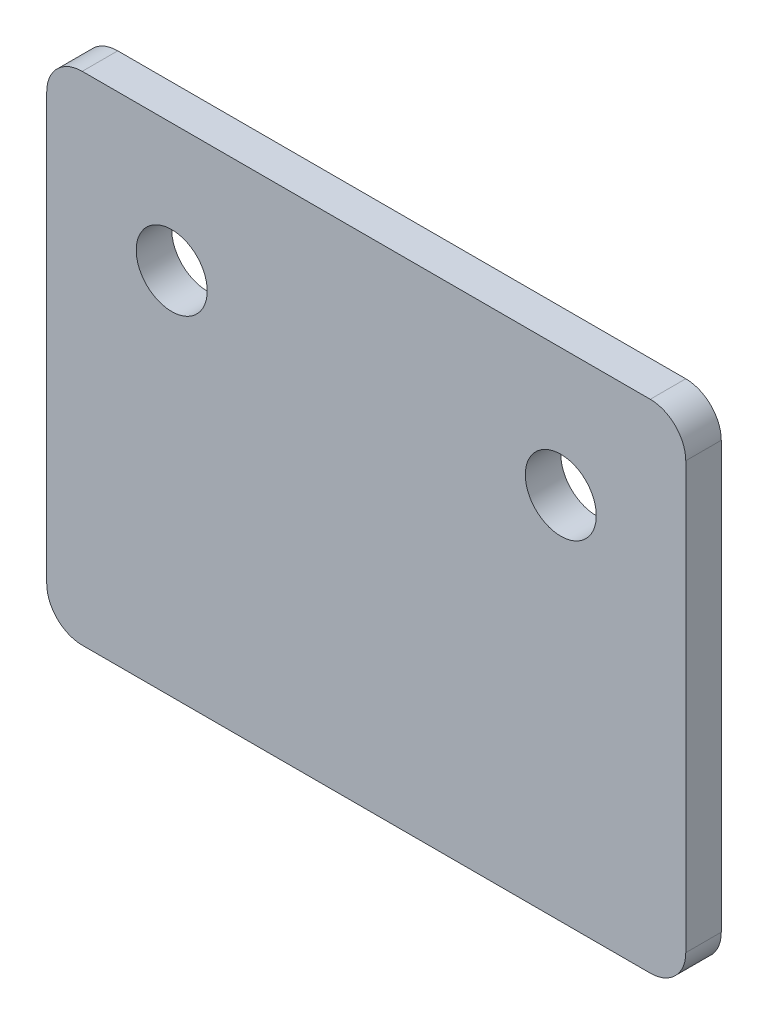
ISO-10303-21;
HEADER;
FILE_DESCRIPTION(('STEP AP214'),'2;1');
FILE_NAME('part.step','',(''),(''),'','','');
FILE_SCHEMA(('AUTOMOTIVE_DESIGN { 1 0 10303 214 1 1 1 1 }'));
ENDSEC;
DATA;
#1=APPLICATION_CONTEXT('core data for automotive mechanical design processes');
#2=APPLICATION_PROTOCOL_DEFINITION('international standard','automotive_design',2000,#1);
#3=PRODUCT_CONTEXT('',#1,'mechanical');
#4=PRODUCT('Part','Part','',(#3));
#5=PRODUCT_RELATED_PRODUCT_CATEGORY('part','',(#4));
#6=PRODUCT_DEFINITION_FORMATION('','',#4);
#7=PRODUCT_DEFINITION_CONTEXT('part definition',#1,'design');
#8=PRODUCT_DEFINITION('design','',#6,#7);
#9=PRODUCT_DEFINITION_SHAPE('','',#8);
#10=(LENGTH_UNIT() NAMED_UNIT(*) SI_UNIT(.MILLI.,.METRE.));
#11=(NAMED_UNIT(*) PLANE_ANGLE_UNIT() SI_UNIT($,.RADIAN.));
#12=(NAMED_UNIT(*) SI_UNIT($,.STERADIAN.) SOLID_ANGLE_UNIT());
#13=UNCERTAINTY_MEASURE_WITH_UNIT(LENGTH_MEASURE(1.E-05),#10,'distance_accuracy_value','');
#14=(GEOMETRIC_REPRESENTATION_CONTEXT(3) GLOBAL_UNCERTAINTY_ASSIGNED_CONTEXT((#13)) GLOBAL_UNIT_ASSIGNED_CONTEXT((#10,
#11,#12)) REPRESENTATION_CONTEXT('',''));
#15=CARTESIAN_POINT('',(0.,0.,0.));
#16=DIRECTION('',(0.,0.,1.));
#17=DIRECTION('',(1.,0.,0.));
#18=AXIS2_PLACEMENT_3D('',#15,#16,#17);
#19=CARTESIAN_POINT('',(-25.1539512231324,-35.029226262124,-3.175));
#20=DIRECTION('',(0.,0.,1.));
#21=DIRECTION('',(1.,0.,0.));
#22=AXIS2_PLACEMENT_3D('',#19,#20,#21);
#23=CYLINDRICAL_SURFACE('',#22,3.175);
#24=CARTESIAN_POINT('',(-25.1539512231324,-35.029226262124,0.));
#25=DIRECTION('',(0.,0.,1.));
#26=DIRECTION('',(1.,0.,0.));
#27=AXIS2_PLACEMENT_3D('',#24,#25,#26);
#28=CIRCLE('',#27,3.175);
#29=CARTESIAN_POINT('',(-28.3289512231324,-35.029226262124,0.));
#30=VERTEX_POINT('',#29);
#31=CARTESIAN_POINT('',(-25.1539512231323,-38.204226262124,0.));
#32=VERTEX_POINT('',#31);
#33=EDGE_CURVE('E133',#30,#32,#28,.T.);
#34=ORIENTED_EDGE('',*,*,#33,.F.);
#35=DIRECTION('',(0.,0.,1.));
#36=VECTOR('',#35,1.);
#37=CARTESIAN_POINT('',(-28.3289512231324,-35.029226262124,-3.175));
#38=LINE('',#37,#36);
#39=CARTESIAN_POINT('',(-28.3289512231324,-35.029226262124,-3.175));
#40=VERTEX_POINT('',#39);
#41=EDGE_CURVE('E11',#40,#30,#38,.T.);
#42=ORIENTED_EDGE('',*,*,#41,.F.);
#43=CARTESIAN_POINT('',(-25.1539512231324,-35.029226262124,-3.175));
#44=DIRECTION('',(0.,0.,1.));
#45=DIRECTION('',(1.,0.,0.));
#46=AXIS2_PLACEMENT_3D('',#43,#44,#45);
#47=CIRCLE('',#46,3.175);
#48=CARTESIAN_POINT('',(-25.1539512231323,-38.204226262124,-3.175));
#49=VERTEX_POINT('',#48);
#50=EDGE_CURVE('E154',#40,#49,#47,.T.);
#51=ORIENTED_EDGE('',*,*,#50,.T.);
#52=DIRECTION('',(0.,0.,1.));
#53=VECTOR('',#52,1.);
#54=CARTESIAN_POINT('',(-25.1539512231323,-38.204226262124,-3.175));
#55=LINE('',#54,#53);
#56=EDGE_CURVE('E39',#49,#32,#55,.T.);
#57=ORIENTED_EDGE('',*,*,#56,.T.);
#58=EDGE_LOOP('',(#34,#42,#51,#57));
#59=FACE_BOUND('',#58,.T.);
#60=ADVANCED_FACE('F36',(#59),#23,.T.);
#61=CARTESIAN_POINT('',(-28.3289512231324,3.07077373787596,-3.175));
#62=DIRECTION('',(-1.,0.,0.));
#63=DIRECTION('',(0.,-1.,0.));
#64=AXIS2_PLACEMENT_3D('',#61,#62,#63);
#65=PLANE('',#64);
#66=DIRECTION('',(0.,-1.,0.));
#67=VECTOR('',#66,1.);
#68=CARTESIAN_POINT('',(-28.3289512231324,3.07077373787596,0.));
#69=LINE('',#68,#67);
#70=CARTESIAN_POINT('',(-28.3289512231324,3.07077373787596,0.));
#71=VERTEX_POINT('',#70);
#72=EDGE_CURVE('E152',#71,#30,#69,.T.);
#73=ORIENTED_EDGE('',*,*,#72,.F.);
#74=DIRECTION('',(0.,0.,1.));
#75=VECTOR('',#74,1.);
#76=CARTESIAN_POINT('',(-28.3289512231324,3.07077373787596,-3.175));
#77=LINE('',#76,#75);
#78=CARTESIAN_POINT('',(-28.3289512231324,3.07077373787596,-3.175));
#79=VERTEX_POINT('',#78);
#80=EDGE_CURVE('E45',#79,#71,#77,.T.);
#81=ORIENTED_EDGE('',*,*,#80,.F.);
#82=DIRECTION('',(0.,-1.,0.));
#83=VECTOR('',#82,1.);
#84=CARTESIAN_POINT('',(-28.3289512231324,3.07077373787596,-3.175));
#85=LINE('',#84,#83);
#86=EDGE_CURVE('E123',#79,#40,#85,.T.);
#87=ORIENTED_EDGE('',*,*,#86,.T.);
#88=ORIENTED_EDGE('',*,*,#41,.T.);
#89=EDGE_LOOP('',(#73,#81,#87,#88));
#90=FACE_BOUND('',#89,.T.);
#91=ADVANCED_FACE('F166',(#90),#65,.T.);
#92=CARTESIAN_POINT('',(-25.1539512231324,3.07077373787597,-3.175));
#93=DIRECTION('',(0.,0.,1.));
#94=DIRECTION('',(1.,0.,0.));
#95=AXIS2_PLACEMENT_3D('',#92,#93,#94);
#96=CYLINDRICAL_SURFACE('',#95,3.175);
#97=CARTESIAN_POINT('',(-25.1539512231324,3.07077373787597,0.));
#98=DIRECTION('',(0.,0.,1.));
#99=DIRECTION('',(1.,0.,0.));
#100=AXIS2_PLACEMENT_3D('',#97,#98,#99);
#101=CIRCLE('',#100,3.175);
#102=CARTESIAN_POINT('',(-25.1539512231324,6.24577373787597,0.));
#103=VERTEX_POINT('',#102);
#104=EDGE_CURVE('E110',#103,#71,#101,.T.);
#105=ORIENTED_EDGE('',*,*,#104,.F.);
#106=DIRECTION('',(0.,0.,1.));
#107=VECTOR('',#106,1.);
#108=CARTESIAN_POINT('',(-25.1539512231324,6.24577373787597,-3.175));
#109=LINE('',#108,#107);
#110=CARTESIAN_POINT('',(-25.1539512231324,6.24577373787597,-3.175));
#111=VERTEX_POINT('',#110);
#112=EDGE_CURVE('E105',#111,#103,#109,.T.);
#113=ORIENTED_EDGE('',*,*,#112,.F.);
#114=CARTESIAN_POINT('',(-25.1539512231324,3.07077373787597,-3.175));
#115=DIRECTION('',(0.,0.,1.));
#116=DIRECTION('',(1.,0.,0.));
#117=AXIS2_PLACEMENT_3D('',#114,#115,#116);
#118=CIRCLE('',#117,3.175);
#119=EDGE_CURVE('E108',#111,#79,#118,.T.);
#120=ORIENTED_EDGE('',*,*,#119,.T.);
#121=ORIENTED_EDGE('',*,*,#80,.T.);
#122=EDGE_LOOP('',(#105,#113,#120,#121));
#123=FACE_BOUND('',#122,.T.);
#124=ADVANCED_FACE('F107',(#123),#96,.T.);
#125=CARTESIAN_POINT('',(-25.1539512231324,6.24577373787597,-3.175));
#126=DIRECTION('',(0.,1.,0.));
#127=DIRECTION('',(0.,0.,1.));
#128=AXIS2_PLACEMENT_3D('',#125,#126,#127);
#129=PLANE('',#128);
#130=DIRECTION('',(-1.,0.,0.));
#131=VECTOR('',#130,1.);
#132=CARTESIAN_POINT('',(-25.1539512231324,6.24577373787597,0.));
#133=LINE('',#132,#131);
#134=CARTESIAN_POINT('',(25.6460487768676,6.24577373787597,0.));
#135=VERTEX_POINT('',#134);
#136=EDGE_CURVE('E149',#135,#103,#133,.T.);
#137=ORIENTED_EDGE('',*,*,#136,.F.);
#138=DIRECTION('',(0.,0.,1.));
#139=VECTOR('',#138,1.);
#140=CARTESIAN_POINT('',(25.6460487768676,6.24577373787597,-3.175));
#141=LINE('',#140,#139);
#142=CARTESIAN_POINT('',(25.6460487768676,6.24577373787597,-3.175));
#143=VERTEX_POINT('',#142);
#144=EDGE_CURVE('E115',#143,#135,#141,.T.);
#145=ORIENTED_EDGE('',*,*,#144,.F.);
#146=DIRECTION('',(-1.,0.,0.));
#147=VECTOR('',#146,1.);
#148=CARTESIAN_POINT('',(-25.1539512231324,6.24577373787597,-3.175));
#149=LINE('',#148,#147);
#150=EDGE_CURVE('E121',#143,#111,#149,.T.);
#151=ORIENTED_EDGE('',*,*,#150,.T.);
#152=ORIENTED_EDGE('',*,*,#112,.T.);
#153=EDGE_LOOP('',(#137,#145,#151,#152));
#154=FACE_BOUND('',#153,.T.);
#155=ADVANCED_FACE('F125',(#154),#129,.T.);
#156=CARTESIAN_POINT('',(25.6460487768676,3.07077373787597,-3.175));
#157=DIRECTION('',(0.,0.,1.));
#158=DIRECTION('',(1.,0.,0.));
#159=AXIS2_PLACEMENT_3D('',#156,#157,#158);
#160=CYLINDRICAL_SURFACE('',#159,3.175);
#161=CARTESIAN_POINT('',(25.6460487768676,3.07077373787597,0.));
#162=DIRECTION('',(0.,0.,1.));
#163=DIRECTION('',(-1.,0.,0.));
#164=AXIS2_PLACEMENT_3D('',#161,#162,#163);
#165=CIRCLE('',#164,3.175);
#166=CARTESIAN_POINT('',(28.8210487768676,3.07077373787597,0.));
#167=VERTEX_POINT('',#166);
#168=EDGE_CURVE('E146',#167,#135,#165,.T.);
#169=ORIENTED_EDGE('',*,*,#168,.F.);
#170=DIRECTION('',(0.,0.,1.));
#171=VECTOR('',#170,1.);
#172=CARTESIAN_POINT('',(28.8210487768676,3.07077373787597,-3.175));
#173=LINE('',#172,#171);
#174=CARTESIAN_POINT('',(28.8210487768676,3.07077373787597,-3.175));
#175=VERTEX_POINT('',#174);
#176=EDGE_CURVE('E158',#175,#167,#173,.T.);
#177=ORIENTED_EDGE('',*,*,#176,.F.);
#178=CARTESIAN_POINT('',(25.6460487768676,3.07077373787597,-3.175));
#179=DIRECTION('',(0.,0.,1.));
#180=DIRECTION('',(-1.,0.,0.));
#181=AXIS2_PLACEMENT_3D('',#178,#179,#180);
#182=CIRCLE('',#181,3.175);
#183=EDGE_CURVE('E126',#175,#143,#182,.T.);
#184=ORIENTED_EDGE('',*,*,#183,.T.);
#185=ORIENTED_EDGE('',*,*,#144,.T.);
#186=EDGE_LOOP('',(#169,#177,#184,#185));
#187=FACE_BOUND('',#186,.T.);
#188=ADVANCED_FACE('F179',(#187),#160,.T.);
#189=CARTESIAN_POINT('',(28.8210487768676,-35.029226262124,-3.175));
#190=DIRECTION('',(1.,0.,0.));
#191=DIRECTION('',(0.,0.,-1.));
#192=AXIS2_PLACEMENT_3D('',#189,#190,#191);
#193=PLANE('',#192);
#194=DIRECTION('',(0.,1.,0.));
#195=VECTOR('',#194,1.);
#196=CARTESIAN_POINT('',(28.8210487768676,-35.029226262124,0.));
#197=LINE('',#196,#195);
#198=CARTESIAN_POINT('',(28.8210487768676,-35.029226262124,0.));
#199=VERTEX_POINT('',#198);
#200=EDGE_CURVE('E143',#199,#167,#197,.T.);
#201=ORIENTED_EDGE('',*,*,#200,.F.);
#202=DIRECTION('',(0.,0.,1.));
#203=VECTOR('',#202,1.);
#204=CARTESIAN_POINT('',(28.8210487768676,-35.029226262124,-3.175));
#205=LINE('',#204,#203);
#206=CARTESIAN_POINT('',(28.8210487768676,-35.029226262124,-3.175));
#207=VERTEX_POINT('',#206);
#208=EDGE_CURVE('E160',#207,#199,#205,.T.);
#209=ORIENTED_EDGE('',*,*,#208,.F.);
#210=DIRECTION('',(0.,1.,0.));
#211=VECTOR('',#210,1.);
#212=CARTESIAN_POINT('',(28.8210487768676,-35.029226262124,-3.175));
#213=LINE('',#212,#211);
#214=EDGE_CURVE('E128',#207,#175,#213,.T.);
#215=ORIENTED_EDGE('',*,*,#214,.T.);
#216=ORIENTED_EDGE('',*,*,#176,.T.);
#217=EDGE_LOOP('',(#201,#209,#215,#216));
#218=FACE_BOUND('',#217,.T.);
#219=ADVANCED_FACE('F182',(#218),#193,.T.);
#220=CARTESIAN_POINT('',(25.6460487768676,-35.029226262124,-3.175));
#221=DIRECTION('',(0.,0.,1.));
#222=DIRECTION('',(1.,0.,0.));
#223=AXIS2_PLACEMENT_3D('',#220,#221,#222);
#224=CYLINDRICAL_SURFACE('',#223,3.175);
#225=CARTESIAN_POINT('',(25.6460487768676,-35.029226262124,0.));
#226=DIRECTION('',(0.,0.,1.));
#227=DIRECTION('',(-1.,0.,0.));
#228=AXIS2_PLACEMENT_3D('',#225,#226,#227);
#229=CIRCLE('',#228,3.175);
#230=CARTESIAN_POINT('',(25.6460487768676,-38.204226262124,0.));
#231=VERTEX_POINT('',#230);
#232=EDGE_CURVE('E140',#231,#199,#229,.T.);
#233=ORIENTED_EDGE('',*,*,#232,.F.);
#234=DIRECTION('',(0.,0.,1.));
#235=VECTOR('',#234,1.);
#236=CARTESIAN_POINT('',(25.6460487768676,-38.204226262124,-3.175));
#237=LINE('',#236,#235);
#238=CARTESIAN_POINT('',(25.6460487768676,-38.204226262124,-3.175));
#239=VERTEX_POINT('',#238);
#240=EDGE_CURVE('E161',#239,#231,#237,.T.);
#241=ORIENTED_EDGE('',*,*,#240,.F.);
#242=CARTESIAN_POINT('',(25.6460487768676,-35.029226262124,-3.175));
#243=DIRECTION('',(0.,0.,1.));
#244=DIRECTION('',(-1.,0.,0.));
#245=AXIS2_PLACEMENT_3D('',#242,#243,#244);
#246=CIRCLE('',#245,3.175);
#247=EDGE_CURVE('E228',#239,#207,#246,.T.);
#248=ORIENTED_EDGE('',*,*,#247,.T.);
#249=ORIENTED_EDGE('',*,*,#208,.T.);
#250=EDGE_LOOP('',(#233,#241,#248,#249));
#251=FACE_BOUND('',#250,.T.);
#252=ADVANCED_FACE('F186',(#251),#224,.T.);
#253=CARTESIAN_POINT('',(-25.1539512231323,-38.204226262124,-3.175));
#254=DIRECTION('',(0.,-1.,0.));
#255=DIRECTION('',(1.,0.,0.));
#256=AXIS2_PLACEMENT_3D('',#253,#254,#255);
#257=PLANE('',#256);
#258=DIRECTION('',(1.,0.,0.));
#259=VECTOR('',#258,1.);
#260=CARTESIAN_POINT('',(-25.1539512231323,-38.204226262124,0.));
#261=LINE('',#260,#259);
#262=EDGE_CURVE('E136',#32,#231,#261,.T.);
#263=ORIENTED_EDGE('',*,*,#262,.F.);
#264=ORIENTED_EDGE('',*,*,#56,.F.);
#265=DIRECTION('',(1.,0.,0.));
#266=VECTOR('',#265,1.);
#267=CARTESIAN_POINT('',(-25.1539512231323,-38.204226262124,-3.175));
#268=LINE('',#267,#266);
#269=EDGE_CURVE('E226',#49,#239,#268,.T.);
#270=ORIENTED_EDGE('',*,*,#269,.T.);
#271=ORIENTED_EDGE('',*,*,#240,.T.);
#272=EDGE_LOOP('',(#263,#264,#270,#271));
#273=FACE_BOUND('',#272,.T.);
#274=ADVANCED_FACE('F163',(#273),#257,.T.);
#275=CARTESIAN_POINT('',(-25.1539512231324,-35.029226262124,-3.175));
#276=DIRECTION('',(0.,0.,1.));
#277=DIRECTION('',(1.,0.,0.));
#278=AXIS2_PLACEMENT_3D('',#275,#276,#277);
#279=PLANE('',#278);
#280=CARTESIAN_POINT('',(-17.1529512231324,-5.18422626212403,-3.175));
#281=DIRECTION('',(0.,0.,1.));
#282=DIRECTION('',(1.,0.,0.));
#283=AXIS2_PLACEMENT_3D('',#280,#281,#282);
#284=CIRCLE('',#283,3.175);
#285=CARTESIAN_POINT('',(-13.9779512231324,-5.18422626212403,-3.175));
#286=VERTEX_POINT('',#285);
#287=EDGE_CURVE('E137',#286,#286,#284,.T.);
#288=ORIENTED_EDGE('',*,*,#287,.T.);
#289=EDGE_LOOP('',(#288));
#290=FACE_BOUND('',#289,.T.);
#291=CARTESIAN_POINT('',(17.6450487768676,-5.18422626212403,-3.175));
#292=DIRECTION('',(0.,0.,1.));
#293=DIRECTION('',(-1.,0.,0.));
#294=AXIS2_PLACEMENT_3D('',#291,#292,#293);
#295=CIRCLE('',#294,3.175);
#296=CARTESIAN_POINT('',(14.4700487768676,-5.18422626212403,-3.175));
#297=VERTEX_POINT('',#296);
#298=EDGE_CURVE('E216',#297,#297,#295,.T.);
#299=ORIENTED_EDGE('',*,*,#298,.T.);
#300=EDGE_LOOP('',(#299));
#301=FACE_BOUND('',#300,.T.);
#302=ORIENTED_EDGE('',*,*,#50,.F.);
#303=ORIENTED_EDGE('',*,*,#86,.F.);
#304=ORIENTED_EDGE('',*,*,#119,.F.);
#305=ORIENTED_EDGE('',*,*,#150,.F.);
#306=ORIENTED_EDGE('',*,*,#183,.F.);
#307=ORIENTED_EDGE('',*,*,#214,.F.);
#308=ORIENTED_EDGE('',*,*,#247,.F.);
#309=ORIENTED_EDGE('',*,*,#269,.F.);
#310=EDGE_LOOP('',(#302,#303,#304,#305,#306,#307,#308,#309));
#311=FACE_BOUND('',#310,.T.);
#312=ADVANCED_FACE('F119',(#290,#301,#311),#279,.F.);
#313=CARTESIAN_POINT('',(-25.1539512231324,-35.029226262124,0.));
#314=DIRECTION('',(0.,0.,1.));
#315=DIRECTION('',(1.,0.,0.));
#316=AXIS2_PLACEMENT_3D('',#313,#314,#315);
#317=PLANE('',#316);
#318=CARTESIAN_POINT('',(-17.1529512231324,-5.18422626212403,0.));
#319=DIRECTION('',(0.,0.,1.));
#320=DIRECTION('',(1.,0.,0.));
#321=AXIS2_PLACEMENT_3D('',#318,#319,#320);
#322=CIRCLE('',#321,3.175);
#323=CARTESIAN_POINT('',(-13.9779512231324,-5.18422626212403,0.));
#324=VERTEX_POINT('',#323);
#325=EDGE_CURVE('E215',#324,#324,#322,.T.);
#326=ORIENTED_EDGE('',*,*,#325,.F.);
#327=EDGE_LOOP('',(#326));
#328=FACE_BOUND('',#327,.T.);
#329=CARTESIAN_POINT('',(17.6450487768676,-5.18422626212403,0.));
#330=DIRECTION('',(0.,0.,1.));
#331=DIRECTION('',(-1.,0.,0.));
#332=AXIS2_PLACEMENT_3D('',#329,#330,#331);
#333=CIRCLE('',#332,3.175);
#334=CARTESIAN_POINT('',(14.4700487768676,-5.18422626212403,0.));
#335=VERTEX_POINT('',#334);
#336=EDGE_CURVE('E220',#335,#335,#333,.T.);
#337=ORIENTED_EDGE('',*,*,#336,.F.);
#338=EDGE_LOOP('',(#337));
#339=FACE_BOUND('',#338,.T.);
#340=ORIENTED_EDGE('',*,*,#33,.T.);
#341=ORIENTED_EDGE('',*,*,#262,.T.);
#342=ORIENTED_EDGE('',*,*,#232,.T.);
#343=ORIENTED_EDGE('',*,*,#200,.T.);
#344=ORIENTED_EDGE('',*,*,#168,.T.);
#345=ORIENTED_EDGE('',*,*,#136,.T.);
#346=ORIENTED_EDGE('',*,*,#104,.T.);
#347=ORIENTED_EDGE('',*,*,#72,.T.);
#348=EDGE_LOOP('',(#340,#341,#342,#343,#344,#345,#346,#347));
#349=FACE_BOUND('',#348,.T.);
#350=ADVANCED_FACE('F165',(#328,#339,#349),#317,.T.);
#351=CARTESIAN_POINT('',(17.6450487768676,-5.18422626212403,-3.175));
#352=DIRECTION('',(0.,0.,1.));
#353=DIRECTION('',(1.,0.,0.));
#354=AXIS2_PLACEMENT_3D('',#351,#352,#353);
#355=CYLINDRICAL_SURFACE('',#354,3.175);
#356=ORIENTED_EDGE('',*,*,#298,.F.);
#357=EDGE_LOOP('',(#356));
#358=FACE_BOUND('',#357,.T.);
#359=ORIENTED_EDGE('',*,*,#336,.T.);
#360=EDGE_LOOP('',(#359));
#361=FACE_BOUND('',#360,.T.);
#362=ADVANCED_FACE('F198',(#358,#361),#355,.F.);
#363=CARTESIAN_POINT('',(-17.1529512231324,-5.18422626212403,-3.175));
#364=DIRECTION('',(0.,0.,1.));
#365=DIRECTION('',(1.,0.,0.));
#366=AXIS2_PLACEMENT_3D('',#363,#364,#365);
#367=CYLINDRICAL_SURFACE('',#366,3.175);
#368=ORIENTED_EDGE('',*,*,#287,.F.);
#369=EDGE_LOOP('',(#368));
#370=FACE_BOUND('',#369,.T.);
#371=ORIENTED_EDGE('',*,*,#325,.T.);
#372=EDGE_LOOP('',(#371));
#373=FACE_BOUND('',#372,.T.);
#374=ADVANCED_FACE('F205',(#370,#373),#367,.F.);
#375=CLOSED_SHELL('',(#60,#91,#124,#155,#188,#219,#252,#274,#312,#350,#362,#374));
#376=MANIFOLD_SOLID_BREP('B2',#375);
#377=ADVANCED_BREP_SHAPE_REPRESENTATION('',(#18,#376),#14);
#378=SHAPE_DEFINITION_REPRESENTATION(#9,#377);
ENDSEC;
END-ISO-10303-21;
